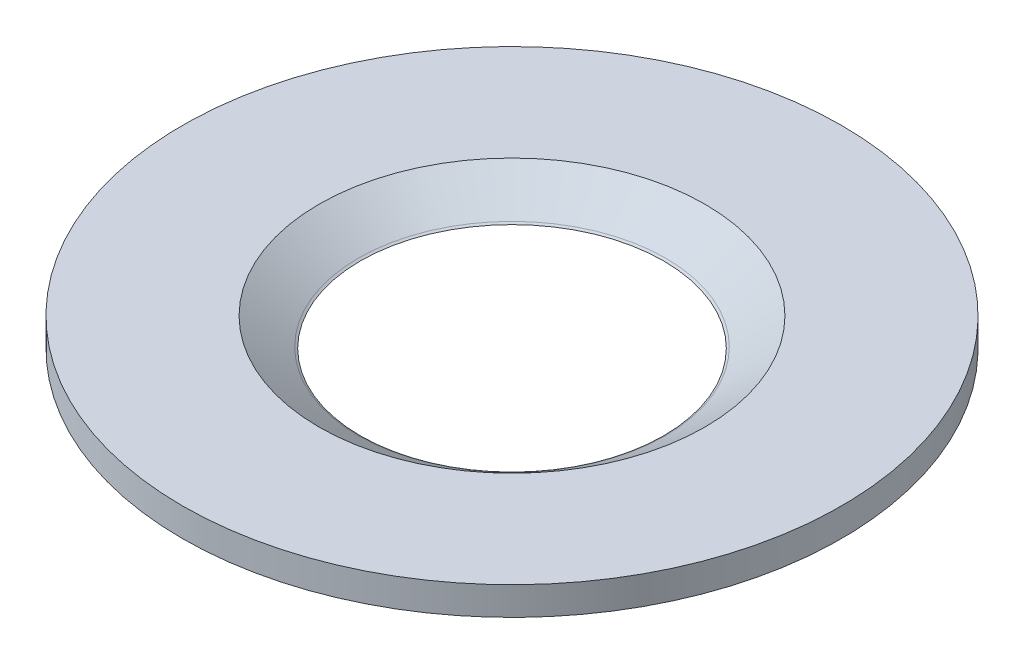
ISO-10303-21;
HEADER;
FILE_DESCRIPTION(('STEP AP214'),'2;1');
FILE_NAME('part.step','',(''),(''),'','','');
FILE_SCHEMA(('AUTOMOTIVE_DESIGN { 1 0 10303 214 1 1 1 1 }'));
ENDSEC;
DATA;
#1=APPLICATION_CONTEXT('core data for automotive mechanical design processes');
#2=APPLICATION_PROTOCOL_DEFINITION('international standard','automotive_design',2000,#1);
#3=PRODUCT_CONTEXT('',#1,'mechanical');
#4=PRODUCT('Part','Part','',(#3));
#5=PRODUCT_RELATED_PRODUCT_CATEGORY('part','',(#4));
#6=PRODUCT_DEFINITION_FORMATION('','',#4);
#7=PRODUCT_DEFINITION_CONTEXT('part definition',#1,'design');
#8=PRODUCT_DEFINITION('design','',#6,#7);
#9=PRODUCT_DEFINITION_SHAPE('','',#8);
#10=(LENGTH_UNIT() NAMED_UNIT(*) SI_UNIT(.MILLI.,.METRE.));
#11=(NAMED_UNIT(*) PLANE_ANGLE_UNIT() SI_UNIT($,.RADIAN.));
#12=(NAMED_UNIT(*) SI_UNIT($,.STERADIAN.) SOLID_ANGLE_UNIT());
#13=UNCERTAINTY_MEASURE_WITH_UNIT(LENGTH_MEASURE(1.E-05),#10,'distance_accuracy_value','');
#14=(GEOMETRIC_REPRESENTATION_CONTEXT(3) GLOBAL_UNCERTAINTY_ASSIGNED_CONTEXT((#13)) GLOBAL_UNIT_ASSIGNED_CONTEXT((#10,
#11,#12)) REPRESENTATION_CONTEXT('',''));
#15=CARTESIAN_POINT('',(0.,0.,0.));
#16=DIRECTION('',(0.,0.,1.));
#17=DIRECTION('',(1.,0.,0.));
#18=AXIS2_PLACEMENT_3D('',#15,#16,#17);
#19=CARTESIAN_POINT('',(0.,63.9859137621725,0.));
#20=DIRECTION('',(0.,-1.,0.));
#21=DIRECTION('',(0.,0.,-1.));
#22=AXIS2_PLACEMENT_3D('',#19,#20,#21);
#23=TOROIDAL_SURFACE('',#22,9.40910514864213,1.6010972265214);
#24=CARTESIAN_POINT('',(0.,62.5856,0.));
#25=DIRECTION('',(0.,-1.,0.));
#26=DIRECTION('',(0.,0.,-1.));
#27=AXIS2_PLACEMENT_3D('',#24,#25,#26);
#28=CIRCLE('',#27,10.1854);
#29=CARTESIAN_POINT('',(0.,62.5856,-10.1854));
#30=VERTEX_POINT('',#29);
#31=EDGE_CURVE('E60',#30,#30,#28,.T.);
#32=ORIENTED_EDGE('',*,*,#31,.T.);
#33=EDGE_LOOP('',(#32));
#34=FACE_BOUND('',#33,.T.);
#35=CARTESIAN_POINT('',(0.,62.6745,0.));
#36=DIRECTION('',(0.,-1.,0.));
#37=DIRECTION('',(0.,0.,-1.));
#38=AXIS2_PLACEMENT_3D('',#35,#36,#37);
#39=CIRCLE('',#38,10.32764);
#40=CARTESIAN_POINT('',(0.,62.6745,-10.32764));
#41=VERTEX_POINT('',#40);
#42=EDGE_CURVE('E10',#41,#41,#39,.T.);
#43=ORIENTED_EDGE('',*,*,#42,.F.);
#44=EDGE_LOOP('',(#43));
#45=FACE_BOUND('',#44,.T.);
#46=ADVANCED_FACE('F41',(#34,#45),#23,.F.);
#47=CARTESIAN_POINT('',(0.,64.4906,0.));
#48=DIRECTION('',(0.,1.,0.));
#49=DIRECTION('',(0.,0.,1.));
#50=AXIS2_PLACEMENT_3D('',#47,#48,#49);
#51=CONICAL_SURFACE('',#50,12.97178,0.968957575711611);
#52=ORIENTED_EDGE('',*,*,#42,.T.);
#53=EDGE_LOOP('',(#52));
#54=FACE_BOUND('',#53,.T.);
#55=CARTESIAN_POINT('',(0.,64.4906,0.));
#56=DIRECTION('',(0.,-1.,0.));
#57=DIRECTION('',(0.,0.,-1.));
#58=AXIS2_PLACEMENT_3D('',#55,#56,#57);
#59=CIRCLE('',#58,12.97178);
#60=CARTESIAN_POINT('',(0.,64.4906,-12.97178));
#61=VERTEX_POINT('',#60);
#62=EDGE_CURVE('E47',#61,#61,#59,.T.);
#63=ORIENTED_EDGE('',*,*,#62,.F.);
#64=EDGE_LOOP('',(#63));
#65=FACE_BOUND('',#64,.T.);
#66=ADVANCED_FACE('F78',(#54,#65),#51,.F.);
#67=CARTESIAN_POINT('',(22.1488,64.4906,0.));
#68=DIRECTION('',(0.,1.,0.));
#69=DIRECTION('',(0.,0.,1.));
#70=AXIS2_PLACEMENT_3D('',#67,#68,#69);
#71=PLANE('',#70);
#72=ORIENTED_EDGE('',*,*,#62,.T.);
#73=EDGE_LOOP('',(#72));
#74=FACE_BOUND('',#73,.T.);
#75=CARTESIAN_POINT('',(0.,64.4906,0.));
#76=DIRECTION('',(0.,-1.,0.));
#77=DIRECTION('',(0.,0.,-1.));
#78=AXIS2_PLACEMENT_3D('',#75,#76,#77);
#79=CIRCLE('',#78,22.1488);
#80=CARTESIAN_POINT('',(0.,64.4906,-22.1488));
#81=VERTEX_POINT('',#80);
#82=EDGE_CURVE('E51',#81,#81,#79,.T.);
#83=ORIENTED_EDGE('',*,*,#82,.F.);
#84=EDGE_LOOP('',(#83));
#85=FACE_BOUND('',#84,.T.);
#86=ADVANCED_FACE('F74',(#74,#85),#71,.T.);
#87=CARTESIAN_POINT('',(0.,-25.4,0.));
#88=DIRECTION('',(0.,-1.,0.));
#89=DIRECTION('',(0.,0.,-1.));
#90=AXIS2_PLACEMENT_3D('',#87,#88,#89);
#91=CYLINDRICAL_SURFACE('',#90,22.1488);
#92=ORIENTED_EDGE('',*,*,#82,.T.);
#93=EDGE_LOOP('',(#92));
#94=FACE_BOUND('',#93,.T.);
#95=CARTESIAN_POINT('',(0.,62.5856,0.));
#96=DIRECTION('',(0.,-1.,0.));
#97=DIRECTION('',(0.,0.,-1.));
#98=AXIS2_PLACEMENT_3D('',#95,#96,#97);
#99=CIRCLE('',#98,22.1488);
#100=CARTESIAN_POINT('',(0.,62.5856,-22.1488));
#101=VERTEX_POINT('',#100);
#102=EDGE_CURVE('E55',#101,#101,#99,.T.);
#103=ORIENTED_EDGE('',*,*,#102,.F.);
#104=EDGE_LOOP('',(#103));
#105=FACE_BOUND('',#104,.T.);
#106=ADVANCED_FACE('F68',(#94,#105),#91,.T.);
#107=CARTESIAN_POINT('',(10.1854,62.5856,0.));
#108=DIRECTION('',(0.,-1.,0.));
#109=DIRECTION('',(0.,0.,-1.));
#110=AXIS2_PLACEMENT_3D('',#107,#108,#109);
#111=PLANE('',#110);
#112=ORIENTED_EDGE('',*,*,#102,.T.);
#113=EDGE_LOOP('',(#112));
#114=FACE_BOUND('',#113,.T.);
#115=ORIENTED_EDGE('',*,*,#31,.F.);
#116=EDGE_LOOP('',(#115));
#117=FACE_BOUND('',#116,.T.);
#118=ADVANCED_FACE('F66',(#114,#117),#111,.T.);
#119=CLOSED_SHELL('',(#46,#66,#86,#106,#118));
#120=MANIFOLD_SOLID_BREP('B2',#119);
#121=ADVANCED_BREP_SHAPE_REPRESENTATION('',(#18,#120),#14);
#122=SHAPE_DEFINITION_REPRESENTATION(#9,#121);
ENDSEC;
END-ISO-10303-21;
